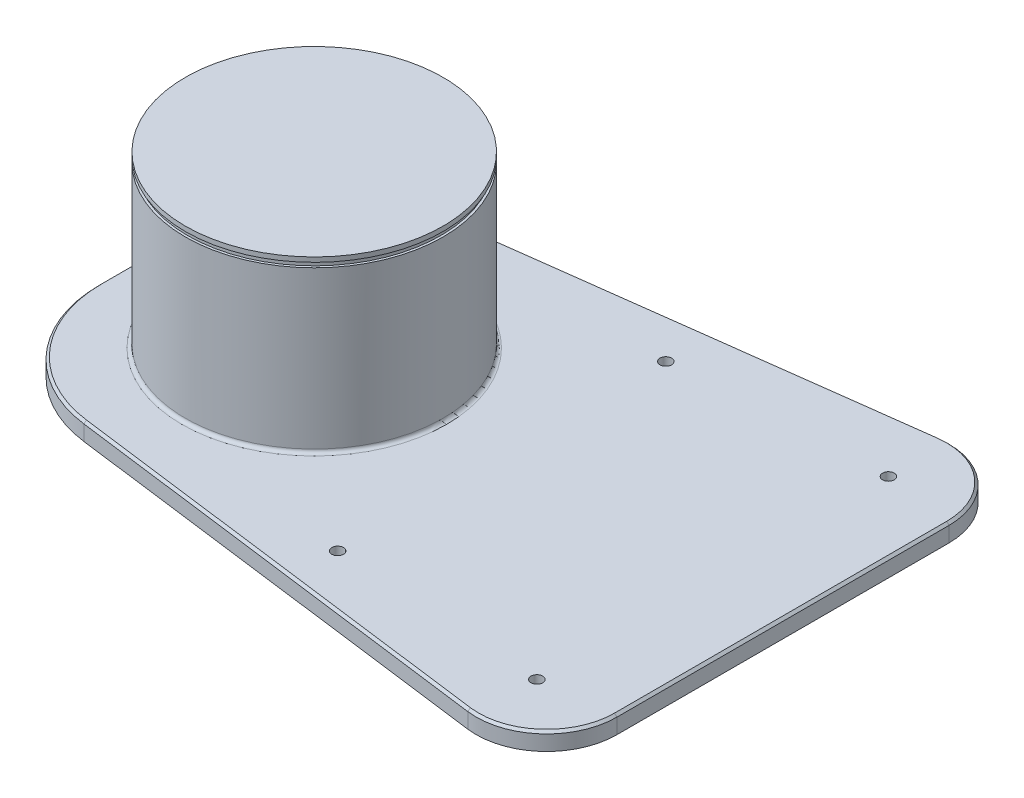
ISO-10303-21;
HEADER;
FILE_DESCRIPTION(('STEP AP214'),'2;1');
FILE_NAME('part.step','',(''),(''),'','','');
FILE_SCHEMA(('AUTOMOTIVE_DESIGN { 1 0 10303 214 1 1 1 1 }'));
ENDSEC;
DATA;
#1=APPLICATION_CONTEXT('core data for automotive mechanical design processes');
#2=APPLICATION_PROTOCOL_DEFINITION('international standard','automotive_design',2000,#1);
#3=PRODUCT_CONTEXT('',#1,'mechanical');
#4=PRODUCT('Part','Part','',(#3));
#5=PRODUCT_RELATED_PRODUCT_CATEGORY('part','',(#4));
#6=PRODUCT_DEFINITION_FORMATION('','',#4);
#7=PRODUCT_DEFINITION_CONTEXT('part definition',#1,'design');
#8=PRODUCT_DEFINITION('design','',#6,#7);
#9=PRODUCT_DEFINITION_SHAPE('','',#8);
#10=(LENGTH_UNIT() NAMED_UNIT(*) SI_UNIT(.MILLI.,.METRE.));
#11=(NAMED_UNIT(*) PLANE_ANGLE_UNIT() SI_UNIT($,.RADIAN.));
#12=(NAMED_UNIT(*) SI_UNIT($,.STERADIAN.) SOLID_ANGLE_UNIT());
#13=UNCERTAINTY_MEASURE_WITH_UNIT(LENGTH_MEASURE(1.E-05),#10,'distance_accuracy_value','');
#14=(GEOMETRIC_REPRESENTATION_CONTEXT(3) GLOBAL_UNCERTAINTY_ASSIGNED_CONTEXT((#13)) GLOBAL_UNIT_ASSIGNED_CONTEXT((#10,
#11,#12)) REPRESENTATION_CONTEXT('',''));
#15=CARTESIAN_POINT('',(0.,0.,0.));
#16=DIRECTION('',(0.,0.,1.));
#17=DIRECTION('',(1.,0.,0.));
#18=AXIS2_PLACEMENT_3D('',#15,#16,#17);
#19=CARTESIAN_POINT('',(0.,160.,0.));
#20=DIRECTION('',(0.,-1.,0.));
#21=DIRECTION('',(0.,0.,-1.));
#22=AXIS2_PLACEMENT_3D('',#19,#20,#21);
#23=CYLINDRICAL_SURFACE('',#22,110.);
#24=CARTESIAN_POINT('',(0.,18.,0.));
#25=DIRECTION('',(0.,-1.,0.));
#26=DIRECTION('',(0.,0.,-1.));
#27=AXIS2_PLACEMENT_3D('',#24,#25,#26);
#28=CIRCLE('',#27,110.);
#29=CARTESIAN_POINT('',(0.,18.,-110.));
#30=VERTEX_POINT('',#29);
#31=EDGE_CURVE('E183',#30,#30,#28,.F.);
#32=ORIENTED_EDGE('',*,*,#31,.T.);
#33=EDGE_LOOP('',(#32));
#34=FACE_BOUND('',#33,.T.);
#35=CARTESIAN_POINT('',(0.,152.,0.));
#36=DIRECTION('',(0.,1.,0.));
#37=DIRECTION('',(0.,0.,1.));
#38=AXIS2_PLACEMENT_3D('',#35,#36,#37);
#39=CIRCLE('',#38,110.);
#40=CARTESIAN_POINT('',(0.,152.,110.));
#41=VERTEX_POINT('',#40);
#42=EDGE_CURVE('E208',#41,#41,#39,.T.);
#43=ORIENTED_EDGE('',*,*,#42,.F.);
#44=EDGE_LOOP('',(#43));
#45=FACE_BOUND('',#44,.T.);
#46=ADVANCED_FACE('F90',(#34,#45),#23,.T.);
#47=CARTESIAN_POINT('',(-30.,15.,-43.3388983031987));
#48=DIRECTION('',(0.,-1.,0.));
#49=DIRECTION('',(0.,0.,-1.));
#50=AXIS2_PLACEMENT_3D('',#47,#48,#49);
#51=CYLINDRICAL_SURFACE('',#50,110.);
#52=DIRECTION('',(0.,-1.,0.));
#53=VECTOR('',#52,1.);
#54=CARTESIAN_POINT('',(-140.,15.,-43.338898303198));
#55=LINE('',#54,#53);
#56=CARTESIAN_POINT('',(-140.,13.0000000000001,-43.338898303198));
#57=VERTEX_POINT('',#56);
#58=CARTESIAN_POINT('',(-140.,0.,-43.338898303198));
#59=VERTEX_POINT('',#58);
#60=EDGE_CURVE('E179',#57,#59,#55,.T.);
#61=ORIENTED_EDGE('',*,*,#60,.F.);
#62=CARTESIAN_POINT('',(-30.,13.0000000000001,-43.3388983031987));
#63=DIRECTION('',(0.,-1.,0.));
#64=DIRECTION('',(0.,0.,-1.));
#65=AXIS2_PLACEMENT_3D('',#62,#63,#64);
#66=CIRCLE('',#65,110.);
#67=CARTESIAN_POINT('',(-44.1409431505528,13.0000000000001,-152.426174036039));
#68=VERTEX_POINT('',#67);
#69=EDGE_CURVE('E13',#57,#68,#66,.T.);
#70=ORIENTED_EDGE('',*,*,#69,.T.);
#71=DIRECTION('',(0.,-1.,0.));
#72=VECTOR('',#71,1.);
#73=CARTESIAN_POINT('',(-44.1409431505528,15.,-152.426174036039));
#74=LINE('',#73,#72);
#75=CARTESIAN_POINT('',(-44.1409431505528,0.,-152.426174036039));
#76=VERTEX_POINT('',#75);
#77=EDGE_CURVE('E200',#68,#76,#74,.T.);
#78=ORIENTED_EDGE('',*,*,#77,.T.);
#79=CARTESIAN_POINT('',(-30.,0.,-43.3388983031987));
#80=DIRECTION('',(0.,1.,0.));
#81=DIRECTION('',(0.,0.,-1.));
#82=AXIS2_PLACEMENT_3D('',#79,#80,#81);
#83=CIRCLE('',#82,110.);
#84=EDGE_CURVE('E192',#76,#59,#83,.T.);
#85=ORIENTED_EDGE('',*,*,#84,.T.);
#86=EDGE_LOOP('',(#61,#70,#78,#85));
#87=FACE_BOUND('',#86,.T.);
#88=ADVANCED_FACE('F196',(#87),#51,.T.);
#89=CARTESIAN_POINT('',(-140.,15.,-43.338898303198));
#90=DIRECTION('',(1.,0.,0.));
#91=DIRECTION('',(0.,0.,-1.));
#92=AXIS2_PLACEMENT_3D('',#89,#90,#91);
#93=PLANE('',#92);
#94=DIRECTION('',(0.,-1.,0.));
#95=VECTOR('',#94,1.);
#96=CARTESIAN_POINT('',(-140.,15.,43.338898303198));
#97=LINE('',#96,#95);
#98=CARTESIAN_POINT('',(-140.,13.0000000000001,43.338898303198));
#99=VERTEX_POINT('',#98);
#100=CARTESIAN_POINT('',(-140.,0.,43.338898303198));
#101=VERTEX_POINT('',#100);
#102=EDGE_CURVE('E186',#99,#101,#97,.T.);
#103=ORIENTED_EDGE('',*,*,#102,.F.);
#104=DIRECTION('',(0.,0.,-1.));
#105=VECTOR('',#104,1.);
#106=CARTESIAN_POINT('',(-140.,13.0000000000001,-43.338898303198));
#107=LINE('',#106,#105);
#108=EDGE_CURVE('E99',#99,#57,#107,.T.);
#109=ORIENTED_EDGE('',*,*,#108,.T.);
#110=ORIENTED_EDGE('',*,*,#60,.T.);
#111=DIRECTION('',(0.,0.,1.));
#112=VECTOR('',#111,1.);
#113=CARTESIAN_POINT('',(-140.,0.,-43.338898303198));
#114=LINE('',#113,#112);
#115=EDGE_CURVE('E182',#59,#101,#114,.T.);
#116=ORIENTED_EDGE('',*,*,#115,.T.);
#117=EDGE_LOOP('',(#103,#109,#110,#116));
#118=FACE_BOUND('',#117,.T.);
#119=ADVANCED_FACE('F180',(#118),#93,.F.);
#120=CARTESIAN_POINT('',(-30.,15.,43.3388983031987));
#121=DIRECTION('',(0.,-1.,0.));
#122=DIRECTION('',(0.,0.,-1.));
#123=AXIS2_PLACEMENT_3D('',#120,#121,#122);
#124=CYLINDRICAL_SURFACE('',#123,110.);
#125=DIRECTION('',(0.,-1.,0.));
#126=VECTOR('',#125,1.);
#127=CARTESIAN_POINT('',(-44.1409431505528,15.,152.426174036039));
#128=LINE('',#127,#126);
#129=CARTESIAN_POINT('',(-44.1409431505528,13.0000000000001,152.426174036039));
#130=VERTEX_POINT('',#129);
#131=CARTESIAN_POINT('',(-44.1409431505528,0.,152.426174036039));
#132=VERTEX_POINT('',#131);
#133=EDGE_CURVE('E249',#130,#132,#128,.T.);
#134=ORIENTED_EDGE('',*,*,#133,.F.);
#135=CARTESIAN_POINT('',(-30.,13.0000000000001,43.3388983031987));
#136=DIRECTION('',(0.,-1.,0.));
#137=DIRECTION('',(0.,0.,-1.));
#138=AXIS2_PLACEMENT_3D('',#135,#136,#137);
#139=CIRCLE('',#138,110.);
#140=EDGE_CURVE('E308',#130,#99,#139,.T.);
#141=ORIENTED_EDGE('',*,*,#140,.T.);
#142=ORIENTED_EDGE('',*,*,#102,.T.);
#143=CARTESIAN_POINT('',(-30.,0.,43.3388983031987));
#144=DIRECTION('',(0.,1.,0.));
#145=DIRECTION('',(0.,0.,1.));
#146=AXIS2_PLACEMENT_3D('',#143,#144,#145);
#147=CIRCLE('',#146,110.);
#148=EDGE_CURVE('E195',#101,#132,#147,.T.);
#149=ORIENTED_EDGE('',*,*,#148,.T.);
#150=EDGE_LOOP('',(#134,#141,#142,#149));
#151=FACE_BOUND('',#150,.T.);
#152=ADVANCED_FACE('F497',(#151),#124,.T.);
#153=CARTESIAN_POINT('',(-44.1409431505528,15.,152.426174036039));
#154=DIRECTION('',(0.128554028641395,0.,-0.991702506662188));
#155=DIRECTION('',(-0.991702506662188,0.,-0.128554028641395));
#156=AXIS2_PLACEMENT_3D('',#153,#154,#155);
#157=PLANE('',#156);
#158=DIRECTION('',(0.,-1.,0.));
#159=VECTOR('',#158,1.);
#160=CARTESIAN_POINT('',(332.286758281516,15.,201.222357555011));
#161=LINE('',#160,#159);
#162=CARTESIAN_POINT('',(332.286758281516,13.0000000000001,201.222357555011));
#163=VERTEX_POINT('',#162);
#164=CARTESIAN_POINT('',(332.286758281516,0.,201.222357555011));
#165=VERTEX_POINT('',#164);
#166=EDGE_CURVE('E244',#163,#165,#161,.T.);
#167=ORIENTED_EDGE('',*,*,#166,.F.);
#168=DIRECTION('',(-0.991702506662188,0.,-0.128554028641395));
#169=VECTOR('',#168,1.);
#170=CARTESIAN_POINT('',(-44.1409431505528,13.0000000000001,152.426174036039));
#171=LINE('',#170,#169);
#172=EDGE_CURVE('E299',#163,#130,#171,.T.);
#173=ORIENTED_EDGE('',*,*,#172,.T.);
#174=ORIENTED_EDGE('',*,*,#133,.T.);
#175=DIRECTION('',(0.991702506662188,0.,0.128554028641395));
#176=VECTOR('',#175,1.);
#177=CARTESIAN_POINT('',(-44.1409431505528,0.,152.426174036039));
#178=LINE('',#177,#176);
#179=EDGE_CURVE('E212',#132,#165,#178,.T.);
#180=ORIENTED_EDGE('',*,*,#179,.T.);
#181=EDGE_LOOP('',(#167,#173,#174,#180));
#182=FACE_BOUND('',#181,.T.);
#183=ADVANCED_FACE('F495',(#182),#157,.F.);
#184=CARTESIAN_POINT('',(340.,15.,141.72020715528));
#185=DIRECTION('',(0.,-1.,0.));
#186=DIRECTION('',(0.,0.,-1.));
#187=AXIS2_PLACEMENT_3D('',#184,#185,#186);
#188=CYLINDRICAL_SURFACE('',#187,60.);
#189=DIRECTION('',(0.,-1.,0.));
#190=VECTOR('',#189,1.);
#191=CARTESIAN_POINT('',(400.,15.,141.72020715528));
#192=LINE('',#191,#190);
#193=CARTESIAN_POINT('',(400.,13.0000000000001,141.72020715528));
#194=VERTEX_POINT('',#193);
#195=CARTESIAN_POINT('',(400.,0.,141.72020715528));
#196=VERTEX_POINT('',#195);
#197=EDGE_CURVE('E245',#194,#196,#192,.T.);
#198=ORIENTED_EDGE('',*,*,#197,.F.);
#199=CARTESIAN_POINT('',(340.,13.0000000000001,141.72020715528));
#200=DIRECTION('',(0.,-1.,0.));
#201=DIRECTION('',(0.,0.,-1.));
#202=AXIS2_PLACEMENT_3D('',#199,#200,#201);
#203=CIRCLE('',#202,60.);
#204=EDGE_CURVE('E291',#194,#163,#203,.T.);
#205=ORIENTED_EDGE('',*,*,#204,.T.);
#206=ORIENTED_EDGE('',*,*,#166,.T.);
#207=CARTESIAN_POINT('',(340.,0.,141.72020715528));
#208=DIRECTION('',(0.,1.,0.));
#209=DIRECTION('',(0.,0.,1.));
#210=AXIS2_PLACEMENT_3D('',#207,#208,#209);
#211=CIRCLE('',#210,60.);
#212=EDGE_CURVE('E218',#165,#196,#211,.T.);
#213=ORIENTED_EDGE('',*,*,#212,.T.);
#214=EDGE_LOOP('',(#198,#205,#206,#213));
#215=FACE_BOUND('',#214,.T.);
#216=ADVANCED_FACE('F488',(#215),#188,.T.);
#217=CARTESIAN_POINT('',(400.,15.,141.72020715528));
#218=DIRECTION('',(-1.,0.,0.));
#219=DIRECTION('',(0.,0.,1.));
#220=AXIS2_PLACEMENT_3D('',#217,#218,#219);
#221=PLANE('',#220);
#222=DIRECTION('',(0.,-1.,0.));
#223=VECTOR('',#222,1.);
#224=CARTESIAN_POINT('',(400.,15.,-141.72020715528));
#225=LINE('',#224,#223);
#226=CARTESIAN_POINT('',(400.,13.0000000000001,-141.72020715528));
#227=VERTEX_POINT('',#226);
#228=CARTESIAN_POINT('',(400.,0.,-141.72020715528));
#229=VERTEX_POINT('',#228);
#230=EDGE_CURVE('E239',#227,#229,#225,.T.);
#231=ORIENTED_EDGE('',*,*,#230,.F.);
#232=DIRECTION('',(0.,0.,1.));
#233=VECTOR('',#232,1.);
#234=CARTESIAN_POINT('',(400.,13.0000000000001,141.72020715528));
#235=LINE('',#234,#233);
#236=EDGE_CURVE('E300',#227,#194,#235,.T.);
#237=ORIENTED_EDGE('',*,*,#236,.T.);
#238=ORIENTED_EDGE('',*,*,#197,.T.);
#239=DIRECTION('',(0.,0.,-1.));
#240=VECTOR('',#239,1.);
#241=CARTESIAN_POINT('',(400.,0.,141.72020715528));
#242=LINE('',#241,#240);
#243=EDGE_CURVE('E224',#196,#229,#242,.T.);
#244=ORIENTED_EDGE('',*,*,#243,.T.);
#245=EDGE_LOOP('',(#231,#237,#238,#244));
#246=FACE_BOUND('',#245,.T.);
#247=ADVANCED_FACE('F482',(#246),#221,.F.);
#248=CARTESIAN_POINT('',(340.,15.,-141.72020715528));
#249=DIRECTION('',(0.,-1.,0.));
#250=DIRECTION('',(0.,0.,-1.));
#251=AXIS2_PLACEMENT_3D('',#248,#249,#250);
#252=CYLINDRICAL_SURFACE('',#251,60.);
#253=DIRECTION('',(0.,-1.,0.));
#254=VECTOR('',#253,1.);
#255=CARTESIAN_POINT('',(332.286758281516,15.,-201.222357555011));
#256=LINE('',#255,#254);
#257=CARTESIAN_POINT('',(332.286758281516,13.0000000000001,-201.222357555011));
#258=VERTEX_POINT('',#257);
#259=CARTESIAN_POINT('',(332.286758281516,0.,-201.222357555011));
#260=VERTEX_POINT('',#259);
#261=EDGE_CURVE('E237',#258,#260,#256,.T.);
#262=ORIENTED_EDGE('',*,*,#261,.F.);
#263=CARTESIAN_POINT('',(340.,13.0000000000001,-141.72020715528));
#264=DIRECTION('',(0.,-1.,0.));
#265=DIRECTION('',(0.,0.,-1.));
#266=AXIS2_PLACEMENT_3D('',#263,#264,#265);
#267=CIRCLE('',#266,60.);
#268=EDGE_CURVE('E304',#258,#227,#267,.T.);
#269=ORIENTED_EDGE('',*,*,#268,.T.);
#270=ORIENTED_EDGE('',*,*,#230,.T.);
#271=CARTESIAN_POINT('',(340.,0.,-141.72020715528));
#272=DIRECTION('',(0.,1.,0.));
#273=DIRECTION('',(0.,0.,1.));
#274=AXIS2_PLACEMENT_3D('',#271,#272,#273);
#275=CIRCLE('',#274,60.);
#276=EDGE_CURVE('E230',#229,#260,#275,.T.);
#277=ORIENTED_EDGE('',*,*,#276,.T.);
#278=EDGE_LOOP('',(#262,#269,#270,#277));
#279=FACE_BOUND('',#278,.T.);
#280=ADVANCED_FACE('F480',(#279),#252,.T.);
#281=CARTESIAN_POINT('',(332.286758281516,15.,-201.222357555011));
#282=DIRECTION('',(0.128554028641395,0.,0.991702506662188));
#283=DIRECTION('',(0.991702506662188,0.,-0.128554028641395));
#284=AXIS2_PLACEMENT_3D('',#281,#282,#283);
#285=PLANE('',#284);
#286=ORIENTED_EDGE('',*,*,#77,.F.);
#287=DIRECTION('',(0.991702506662188,0.,-0.128554028641395));
#288=VECTOR('',#287,1.);
#289=CARTESIAN_POINT('',(332.286758281516,13.0000000000001,-201.222357555011));
#290=LINE('',#289,#288);
#291=EDGE_CURVE('E310',#68,#258,#290,.T.);
#292=ORIENTED_EDGE('',*,*,#291,.T.);
#293=ORIENTED_EDGE('',*,*,#261,.T.);
#294=DIRECTION('',(-0.991702506662188,0.,0.128554028641395));
#295=VECTOR('',#294,1.);
#296=CARTESIAN_POINT('',(332.286758281516,0.,-201.222357555011));
#297=LINE('',#296,#295);
#298=EDGE_CURVE('E231',#260,#76,#297,.T.);
#299=ORIENTED_EDGE('',*,*,#298,.T.);
#300=EDGE_LOOP('',(#286,#292,#293,#299));
#301=FACE_BOUND('',#300,.T.);
#302=ADVANCED_FACE('F465',(#301),#285,.F.);
#303=CARTESIAN_POINT('',(-30.,15.,-43.3388983031987));
#304=DIRECTION('',(0.,-1.,0.));
#305=DIRECTION('',(0.,0.,-1.));
#306=AXIS2_PLACEMENT_3D('',#303,#304,#305);
#307=PLANE('',#306);
#308=DIRECTION('',(0.991702506662188,0.,0.128554028641395));
#309=VECTOR('',#308,1.);
#310=CARTESIAN_POINT('',(-54.9341578984033,15.,149.010319770198));
#311=LINE('',#310,#309);
#312=CARTESIAN_POINT('',(-43.88383509327,15.,150.442769022715));
#313=VERTEX_POINT('',#312);
#314=CARTESIAN_POINT('',(332.543866338799,15.,199.238952541687));
#315=VERTEX_POINT('',#314);
#316=EDGE_CURVE('E282',#313,#315,#311,.T.);
#317=ORIENTED_EDGE('',*,*,#316,.T.);
#318=CARTESIAN_POINT('',(340.,15.,141.72020715528));
#319=DIRECTION('',(0.,-1.,0.));
#320=DIRECTION('',(0.,0.,-1.));
#321=AXIS2_PLACEMENT_3D('',#318,#319,#320);
#322=CIRCLE('',#321,58.0000000000001);
#323=CARTESIAN_POINT('',(398.,15.,141.72020715528));
#324=VERTEX_POINT('',#323);
#325=EDGE_CURVE('E288',#315,#324,#322,.F.);
#326=ORIENTED_EDGE('',*,*,#325,.T.);
#327=DIRECTION('',(0.,0.,-1.));
#328=VECTOR('',#327,1.);
#329=CARTESIAN_POINT('',(398.,15.,-43.3388983031987));
#330=LINE('',#329,#328);
#331=CARTESIAN_POINT('',(398.,15.,-141.72020715528));
#332=VERTEX_POINT('',#331);
#333=EDGE_CURVE('E286',#324,#332,#330,.T.);
#334=ORIENTED_EDGE('',*,*,#333,.T.);
#335=CARTESIAN_POINT('',(340.,15.,-141.72020715528));
#336=DIRECTION('',(0.,-1.,0.));
#337=DIRECTION('',(0.,0.,-1.));
#338=AXIS2_PLACEMENT_3D('',#335,#336,#337);
#339=CIRCLE('',#338,58.0000000000001);
#340=CARTESIAN_POINT('',(332.543866338799,15.,-199.238952541687));
#341=VERTEX_POINT('',#340);
#342=EDGE_CURVE('E278',#332,#341,#339,.F.);
#343=ORIENTED_EDGE('',*,*,#342,.T.);
#344=DIRECTION('',(-0.991702506662188,0.,0.128554028641395));
#345=VECTOR('',#344,1.);
#346=CARTESIAN_POINT('',(-43.8838350932707,15.,-150.442769022715));
#347=LINE('',#346,#345);
#348=CARTESIAN_POINT('',(-43.88383509327,15.,-150.442769022715));
#349=VERTEX_POINT('',#348);
#350=EDGE_CURVE('E273',#341,#349,#347,.T.);
#351=ORIENTED_EDGE('',*,*,#350,.T.);
#352=CARTESIAN_POINT('',(-30.,15.,-43.3388983031987));
#353=DIRECTION('',(0.,-1.,0.));
#354=DIRECTION('',(0.,0.,-1.));
#355=AXIS2_PLACEMENT_3D('',#352,#353,#354);
#356=CIRCLE('',#355,108.);
#357=CARTESIAN_POINT('',(-138.,15.,-43.338898303198));
#358=VERTEX_POINT('',#357);
#359=EDGE_CURVE('E268',#349,#358,#356,.F.);
#360=ORIENTED_EDGE('',*,*,#359,.T.);
#361=DIRECTION('',(0.,0.,1.));
#362=VECTOR('',#361,1.);
#363=CARTESIAN_POINT('',(-138.,15.,-43.3388983031987));
#364=LINE('',#363,#362);
#365=CARTESIAN_POINT('',(-138.,15.,43.338898303198));
#366=VERTEX_POINT('',#365);
#367=EDGE_CURVE('E271',#358,#366,#364,.T.);
#368=ORIENTED_EDGE('',*,*,#367,.T.);
#369=CARTESIAN_POINT('',(-30.,15.,43.3388983031987));
#370=DIRECTION('',(0.,-1.,0.));
#371=DIRECTION('',(0.,0.,-1.));
#372=AXIS2_PLACEMENT_3D('',#369,#370,#371);
#373=CIRCLE('',#372,108.);
#374=EDGE_CURVE('E280',#366,#313,#373,.F.);
#375=ORIENTED_EDGE('',*,*,#374,.T.);
#376=EDGE_LOOP('',(#317,#326,#334,#343,#351,#360,#368,#375));
#377=FACE_BOUND('',#376,.T.);
#378=CARTESIAN_POINT('',(0.,15.,0.));
#379=DIRECTION('',(0.,-1.,0.));
#380=DIRECTION('',(0.,0.,-1.));
#381=AXIS2_PLACEMENT_3D('',#378,#379,#380);
#382=CIRCLE('',#381,113.);
#383=CARTESIAN_POINT('',(0.,15.,-113.));
#384=VERTEX_POINT('',#383);
#385=EDGE_CURVE('E262',#384,#384,#382,.T.);
#386=ORIENTED_EDGE('',*,*,#385,.T.);
#387=EDGE_LOOP('',(#386));
#388=FACE_BOUND('',#387,.T.);
#389=CARTESIAN_POINT('',(340.,15.,-150.));
#390=DIRECTION('',(0.,1.,0.));
#391=DIRECTION('',(0.,0.,1.));
#392=AXIS2_PLACEMENT_3D('',#389,#390,#391);
#393=CIRCLE('',#392,5.);
#394=CARTESIAN_POINT('',(340.,15.,-145.));
#395=VERTEX_POINT('',#394);
#396=EDGE_CURVE('E362',#395,#395,#393,.T.);
#397=ORIENTED_EDGE('',*,*,#396,.F.);
#398=EDGE_LOOP('',(#397));
#399=FACE_BOUND('',#398,.T.);
#400=CARTESIAN_POINT('',(160.,15.,140.));
#401=DIRECTION('',(0.,1.,0.));
#402=DIRECTION('',(0.,0.,1.));
#403=AXIS2_PLACEMENT_3D('',#400,#401,#402);
#404=CIRCLE('',#403,5.);
#405=CARTESIAN_POINT('',(160.,15.,145.));
#406=VERTEX_POINT('',#405);
#407=EDGE_CURVE('E371',#406,#406,#404,.T.);
#408=ORIENTED_EDGE('',*,*,#407,.F.);
#409=EDGE_LOOP('',(#408));
#410=FACE_BOUND('',#409,.T.);
#411=CARTESIAN_POINT('',(160.,15.,-140.));
#412=DIRECTION('',(0.,1.,0.));
#413=DIRECTION('',(0.,0.,1.));
#414=AXIS2_PLACEMENT_3D('',#411,#412,#413);
#415=CIRCLE('',#414,5.);
#416=CARTESIAN_POINT('',(160.,15.,-135.));
#417=VERTEX_POINT('',#416);
#418=EDGE_CURVE('E355',#417,#417,#415,.T.);
#419=ORIENTED_EDGE('',*,*,#418,.F.);
#420=EDGE_LOOP('',(#419));
#421=FACE_BOUND('',#420,.T.);
#422=CARTESIAN_POINT('',(340.,15.,150.));
#423=DIRECTION('',(0.,1.,0.));
#424=DIRECTION('',(0.,0.,1.));
#425=AXIS2_PLACEMENT_3D('',#422,#423,#424);
#426=CIRCLE('',#425,5.);
#427=CARTESIAN_POINT('',(340.,15.,155.));
#428=VERTEX_POINT('',#427);
#429=EDGE_CURVE('E368',#428,#428,#426,.T.);
#430=ORIENTED_EDGE('',*,*,#429,.F.);
#431=EDGE_LOOP('',(#430));
#432=FACE_BOUND('',#431,.T.);
#433=ADVANCED_FACE('F459',(#377,#388,#399,#410,#421,#432),#307,.F.);
#434=CARTESIAN_POINT('',(-30.,0.,-43.3388983031987));
#435=DIRECTION('',(0.,-1.,0.));
#436=DIRECTION('',(0.,0.,-1.));
#437=AXIS2_PLACEMENT_3D('',#434,#435,#436);
#438=PLANE('',#437);
#439=CARTESIAN_POINT('',(340.,0.,-150.));
#440=DIRECTION('',(0.,1.,0.));
#441=DIRECTION('',(0.,0.,1.));
#442=AXIS2_PLACEMENT_3D('',#439,#440,#441);
#443=CIRCLE('',#442,5.);
#444=CARTESIAN_POINT('',(340.,0.,-145.));
#445=VERTEX_POINT('',#444);
#446=EDGE_CURVE('E370',#445,#445,#443,.T.);
#447=ORIENTED_EDGE('',*,*,#446,.T.);
#448=EDGE_LOOP('',(#447));
#449=FACE_BOUND('',#448,.T.);
#450=CARTESIAN_POINT('',(160.,0.,140.));
#451=DIRECTION('',(0.,1.,0.));
#452=DIRECTION('',(0.,0.,1.));
#453=AXIS2_PLACEMENT_3D('',#450,#451,#452);
#454=CIRCLE('',#453,5.);
#455=CARTESIAN_POINT('',(160.,0.,145.));
#456=VERTEX_POINT('',#455);
#457=EDGE_CURVE('E358',#456,#456,#454,.T.);
#458=ORIENTED_EDGE('',*,*,#457,.T.);
#459=EDGE_LOOP('',(#458));
#460=FACE_BOUND('',#459,.T.);
#461=CARTESIAN_POINT('',(160.,0.,-140.));
#462=DIRECTION('',(0.,1.,0.));
#463=DIRECTION('',(0.,0.,1.));
#464=AXIS2_PLACEMENT_3D('',#461,#462,#463);
#465=CIRCLE('',#464,5.);
#466=CARTESIAN_POINT('',(160.,0.,-135.));
#467=VERTEX_POINT('',#466);
#468=EDGE_CURVE('E345',#467,#467,#465,.T.);
#469=ORIENTED_EDGE('',*,*,#468,.T.);
#470=EDGE_LOOP('',(#469));
#471=FACE_BOUND('',#470,.T.);
#472=CARTESIAN_POINT('',(340.,0.,150.));
#473=DIRECTION('',(0.,1.,0.));
#474=DIRECTION('',(0.,0.,1.));
#475=AXIS2_PLACEMENT_3D('',#472,#473,#474);
#476=CIRCLE('',#475,5.);
#477=CARTESIAN_POINT('',(340.,0.,155.));
#478=VERTEX_POINT('',#477);
#479=EDGE_CURVE('E378',#478,#478,#476,.T.);
#480=ORIENTED_EDGE('',*,*,#479,.T.);
#481=EDGE_LOOP('',(#480));
#482=FACE_BOUND('',#481,.T.);
#483=ORIENTED_EDGE('',*,*,#84,.F.);
#484=ORIENTED_EDGE('',*,*,#298,.F.);
#485=ORIENTED_EDGE('',*,*,#276,.F.);
#486=ORIENTED_EDGE('',*,*,#243,.F.);
#487=ORIENTED_EDGE('',*,*,#212,.F.);
#488=ORIENTED_EDGE('',*,*,#179,.F.);
#489=ORIENTED_EDGE('',*,*,#148,.F.);
#490=ORIENTED_EDGE('',*,*,#115,.F.);
#491=EDGE_LOOP('',(#483,#484,#485,#486,#487,#488,#489,#490));
#492=FACE_BOUND('',#491,.T.);
#493=ADVANCED_FACE('F189',(#449,#460,#471,#482,#492),#438,.T.);
#494=CARTESIAN_POINT('',(0.,152.,0.));
#495=DIRECTION('',(0.,1.,0.));
#496=DIRECTION('',(0.,0.,1.));
#497=AXIS2_PLACEMENT_3D('',#494,#495,#496);
#498=PLANE('',#497);
#499=CARTESIAN_POINT('',(0.,152.,0.));
#500=DIRECTION('',(0.,1.,0.));
#501=DIRECTION('',(0.,0.,1.));
#502=AXIS2_PLACEMENT_3D('',#499,#500,#501);
#503=CIRCLE('',#502,108.);
#504=CARTESIAN_POINT('',(0.,152.,108.));
#505=VERTEX_POINT('',#504);
#506=EDGE_CURVE('E260',#505,#505,#503,.T.);
#507=ORIENTED_EDGE('',*,*,#506,.F.);
#508=EDGE_LOOP('',(#507));
#509=FACE_BOUND('',#508,.T.);
#510=ORIENTED_EDGE('',*,*,#42,.T.);
#511=EDGE_LOOP('',(#510));
#512=FACE_BOUND('',#511,.T.);
#513=ADVANCED_FACE('F407',(#509,#512),#498,.T.);
#514=CARTESIAN_POINT('',(0.,156.,0.));
#515=DIRECTION('',(0.,1.,0.));
#516=DIRECTION('',(0.,0.,1.));
#517=AXIS2_PLACEMENT_3D('',#514,#515,#516);
#518=PLANE('',#517);
#519=CARTESIAN_POINT('',(0.,156.,0.));
#520=DIRECTION('',(0.,1.,0.));
#521=DIRECTION('',(0.,0.,1.));
#522=AXIS2_PLACEMENT_3D('',#519,#520,#521);
#523=CIRCLE('',#522,108.);
#524=CARTESIAN_POINT('',(0.,156.,108.));
#525=VERTEX_POINT('',#524);
#526=EDGE_CURVE('E385',#525,#525,#523,.T.);
#527=ORIENTED_EDGE('',*,*,#526,.T.);
#528=EDGE_LOOP('',(#527));
#529=FACE_BOUND('',#528,.T.);
#530=CARTESIAN_POINT('',(0.,156.,0.));
#531=DIRECTION('',(0.,1.,0.));
#532=DIRECTION('',(0.,0.,1.));
#533=AXIS2_PLACEMENT_3D('',#530,#531,#532);
#534=CIRCLE('',#533,110.);
#535=CARTESIAN_POINT('',(0.,156.,110.));
#536=VERTEX_POINT('',#535);
#537=EDGE_CURVE('E251',#536,#536,#534,.T.);
#538=ORIENTED_EDGE('',*,*,#537,.F.);
#539=EDGE_LOOP('',(#538));
#540=FACE_BOUND('',#539,.T.);
#541=ADVANCED_FACE('F392',(#529,#540),#518,.F.);
#542=CARTESIAN_POINT('',(0.,152.,0.));
#543=DIRECTION('',(0.,1.,0.));
#544=DIRECTION('',(0.,0.,1.));
#545=AXIS2_PLACEMENT_3D('',#542,#543,#544);
#546=CYLINDRICAL_SURFACE('',#545,108.);
#547=ORIENTED_EDGE('',*,*,#506,.T.);
#548=EDGE_LOOP('',(#547));
#549=FACE_BOUND('',#548,.T.);
#550=ORIENTED_EDGE('',*,*,#526,.F.);
#551=EDGE_LOOP('',(#550));
#552=FACE_BOUND('',#551,.T.);
#553=ADVANCED_FACE('F396',(#549,#552),#546,.T.);
#554=CARTESIAN_POINT('',(0.,160.,0.));
#555=DIRECTION('',(0.,1.,0.));
#556=DIRECTION('',(0.,0.,1.));
#557=AXIS2_PLACEMENT_3D('',#554,#555,#556);
#558=PLANE('',#557);
#559=CARTESIAN_POINT('',(0.,160.,0.));
#560=DIRECTION('',(0.,1.,0.));
#561=DIRECTION('',(0.,0.,1.));
#562=AXIS2_PLACEMENT_3D('',#559,#560,#561);
#563=CIRCLE('',#562,110.);
#564=CARTESIAN_POINT('',(0.,160.,110.));
#565=VERTEX_POINT('',#564);
#566=EDGE_CURVE('E205',#565,#565,#563,.T.);
#567=ORIENTED_EDGE('',*,*,#566,.T.);
#568=EDGE_LOOP('',(#567));
#569=FACE_BOUND('',#568,.T.);
#570=ADVANCED_FACE('F399',(#569),#558,.T.);
#571=ORIENTED_EDGE('',*,*,#537,.T.);
#572=EDGE_LOOP('',(#571));
#573=FACE_BOUND('',#572,.T.);
#574=ORIENTED_EDGE('',*,*,#566,.F.);
#575=EDGE_LOOP('',(#574));
#576=FACE_BOUND('',#575,.T.);
#577=ADVANCED_FACE('F403',(#573,#576),#23,.T.);
#578=CARTESIAN_POINT('',(340.,0.,150.));
#579=DIRECTION('',(0.,1.,0.));
#580=DIRECTION('',(0.,0.,1.));
#581=AXIS2_PLACEMENT_3D('',#578,#579,#580);
#582=CYLINDRICAL_SURFACE('',#581,5.);
#583=ORIENTED_EDGE('',*,*,#479,.F.);
#584=EDGE_LOOP('',(#583));
#585=FACE_BOUND('',#584,.T.);
#586=ORIENTED_EDGE('',*,*,#429,.T.);
#587=EDGE_LOOP('',(#586));
#588=FACE_BOUND('',#587,.T.);
#589=ADVANCED_FACE('F424',(#585,#588),#582,.F.);
#590=CARTESIAN_POINT('',(160.,0.,-140.));
#591=DIRECTION('',(0.,1.,0.));
#592=DIRECTION('',(0.,0.,1.));
#593=AXIS2_PLACEMENT_3D('',#590,#591,#592);
#594=CYLINDRICAL_SURFACE('',#593,5.);
#595=ORIENTED_EDGE('',*,*,#468,.F.);
#596=EDGE_LOOP('',(#595));
#597=FACE_BOUND('',#596,.T.);
#598=ORIENTED_EDGE('',*,*,#418,.T.);
#599=EDGE_LOOP('',(#598));
#600=FACE_BOUND('',#599,.T.);
#601=ADVANCED_FACE('F431',(#597,#600),#594,.F.);
#602=CARTESIAN_POINT('',(160.,0.,140.));
#603=DIRECTION('',(0.,1.,0.));
#604=DIRECTION('',(0.,0.,1.));
#605=AXIS2_PLACEMENT_3D('',#602,#603,#604);
#606=CYLINDRICAL_SURFACE('',#605,5.);
#607=ORIENTED_EDGE('',*,*,#457,.F.);
#608=EDGE_LOOP('',(#607));
#609=FACE_BOUND('',#608,.T.);
#610=ORIENTED_EDGE('',*,*,#407,.T.);
#611=EDGE_LOOP('',(#610));
#612=FACE_BOUND('',#611,.T.);
#613=ADVANCED_FACE('F438',(#609,#612),#606,.F.);
#614=CARTESIAN_POINT('',(340.,0.,-150.));
#615=DIRECTION('',(0.,1.,0.));
#616=DIRECTION('',(0.,0.,1.));
#617=AXIS2_PLACEMENT_3D('',#614,#615,#616);
#618=CYLINDRICAL_SURFACE('',#617,5.);
#619=ORIENTED_EDGE('',*,*,#446,.F.);
#620=EDGE_LOOP('',(#619));
#621=FACE_BOUND('',#620,.T.);
#622=ORIENTED_EDGE('',*,*,#396,.T.);
#623=EDGE_LOOP('',(#622));
#624=FACE_BOUND('',#623,.T.);
#625=ADVANCED_FACE('F450',(#621,#624),#618,.F.);
#626=CARTESIAN_POINT('',(0.,18.,0.));
#627=DIRECTION('',(0.,-1.,0.));
#628=DIRECTION('',(0.,0.,-1.));
#629=AXIS2_PLACEMENT_3D('',#626,#627,#628);
#630=TOROIDAL_SURFACE('',#629,113.,3.);
#631=ORIENTED_EDGE('',*,*,#385,.F.);
#632=EDGE_LOOP('',(#631));
#633=FACE_BOUND('',#632,.T.);
#634=ORIENTED_EDGE('',*,*,#31,.F.);
#635=EDGE_LOOP('',(#634));
#636=FACE_BOUND('',#635,.T.);
#637=ADVANCED_FACE('F448',(#633,#636),#630,.F.);
#638=CARTESIAN_POINT('',(-30.,15.,-43.3388983031987));
#639=DIRECTION('',(0.,-1.,0.));
#640=DIRECTION('',(0.,0.,-1.));
#641=AXIS2_PLACEMENT_3D('',#638,#639,#640);
#642=CONICAL_SURFACE('',#641,108.,0.785398163397448);
#643=DIRECTION('',(0.0909014254011806,0.707106781186545,0.701239567380533));
#644=VECTOR('',#643,1.);
#645=CARTESIAN_POINT('',(-44.1409431505528,13.0000000000001,-152.426174036039));
#646=LINE('',#645,#644);
#647=EDGE_CURVE('E333',#68,#349,#646,.T.);
#648=ORIENTED_EDGE('',*,*,#647,.F.);
#649=ORIENTED_EDGE('',*,*,#69,.F.);
#650=DIRECTION('',(-0.707106781186548,-0.707106781186548,0.));
#651=VECTOR('',#650,1.);
#652=CARTESIAN_POINT('',(-138.,15.,-43.338898303198));
#653=LINE('',#652,#651);
#654=EDGE_CURVE('E94',#358,#57,#653,.T.);
#655=ORIENTED_EDGE('',*,*,#654,.F.);
#656=ORIENTED_EDGE('',*,*,#359,.F.);
#657=EDGE_LOOP('',(#648,#649,#655,#656));
#658=FACE_BOUND('',#657,.T.);
#659=ADVANCED_FACE('F95',(#658),#642,.T.);
#660=CARTESIAN_POINT('',(-138.,15.,-43.3388983031987));
#661=DIRECTION('',(0.707106781186543,-0.707106781186552,0.));
#662=DIRECTION('',(0.,0.,1.));
#663=AXIS2_PLACEMENT_3D('',#660,#661,#662);
#664=PLANE('',#663);
#665=ORIENTED_EDGE('',*,*,#654,.T.);
#666=ORIENTED_EDGE('',*,*,#108,.F.);
#667=DIRECTION('',(-0.707106781186552,-0.707106781186543,0.));
#668=VECTOR('',#667,1.);
#669=CARTESIAN_POINT('',(-138.,15.,43.338898303198));
#670=LINE('',#669,#668);
#671=EDGE_CURVE('E335',#366,#99,#670,.T.);
#672=ORIENTED_EDGE('',*,*,#671,.F.);
#673=ORIENTED_EDGE('',*,*,#367,.F.);
#674=EDGE_LOOP('',(#665,#666,#672,#673));
#675=FACE_BOUND('',#674,.T.);
#676=ADVANCED_FACE('F542',(#675),#664,.F.);
#677=CARTESIAN_POINT('',(-43.8838350932707,15.,-150.442769022715));
#678=DIRECTION('',(0.0909014254011795,-0.70710678118655,0.701239567380528));
#679=DIRECTION('',(-0.991702506662188,0.,0.128554028641395));
#680=AXIS2_PLACEMENT_3D('',#677,#678,#679);
#681=PLANE('',#680);
#682=ORIENTED_EDGE('',*,*,#647,.T.);
#683=ORIENTED_EDGE('',*,*,#350,.F.);
#684=DIRECTION('',(0.0909014254011878,0.707106781186546,0.701239567380531));
#685=VECTOR('',#684,1.);
#686=CARTESIAN_POINT('',(332.286758281516,13.0000000000001,-201.222357555011));
#687=LINE('',#686,#685);
#688=EDGE_CURVE('E327',#258,#341,#687,.T.);
#689=ORIENTED_EDGE('',*,*,#688,.F.);
#690=ORIENTED_EDGE('',*,*,#291,.F.);
#691=EDGE_LOOP('',(#682,#683,#689,#690));
#692=FACE_BOUND('',#691,.T.);
#693=ADVANCED_FACE('F538',(#692),#681,.F.);
#694=CARTESIAN_POINT('',(-30.,15.,43.3388983031987));
#695=DIRECTION('',(0.,-1.,0.));
#696=DIRECTION('',(0.,0.,-1.));
#697=AXIS2_PLACEMENT_3D('',#694,#695,#696);
#698=CONICAL_SURFACE('',#697,108.,0.785398163397452);
#699=ORIENTED_EDGE('',*,*,#671,.T.);
#700=ORIENTED_EDGE('',*,*,#140,.F.);
#701=DIRECTION('',(-0.0909014254011806,-0.707106781186545,0.701239567380533));
#702=VECTOR('',#701,1.);
#703=CARTESIAN_POINT('',(-43.88383509327,15.,150.442769022715));
#704=LINE('',#703,#702);
#705=EDGE_CURVE('E322',#313,#130,#704,.T.);
#706=ORIENTED_EDGE('',*,*,#705,.F.);
#707=ORIENTED_EDGE('',*,*,#374,.F.);
#708=EDGE_LOOP('',(#699,#700,#706,#707));
#709=FACE_BOUND('',#708,.T.);
#710=ADVANCED_FACE('F533',(#709),#698,.T.);
#711=CARTESIAN_POINT('',(340.,15.,-141.72020715528));
#712=DIRECTION('',(0.,-1.,0.));
#713=DIRECTION('',(0.,0.,-1.));
#714=AXIS2_PLACEMENT_3D('',#711,#712,#713);
#715=CONICAL_SURFACE('',#714,58.0000000000001,0.785398163397452);
#716=ORIENTED_EDGE('',*,*,#688,.T.);
#717=ORIENTED_EDGE('',*,*,#342,.F.);
#718=DIRECTION('',(-0.707106781186552,0.707106781186543,0.));
#719=VECTOR('',#718,1.);
#720=CARTESIAN_POINT('',(400.,13.0000000000001,-141.72020715528));
#721=LINE('',#720,#719);
#722=EDGE_CURVE('E319',#227,#332,#721,.T.);
#723=ORIENTED_EDGE('',*,*,#722,.F.);
#724=ORIENTED_EDGE('',*,*,#268,.F.);
#725=EDGE_LOOP('',(#716,#717,#723,#724));
#726=FACE_BOUND('',#725,.T.);
#727=ADVANCED_FACE('F523',(#726),#715,.T.);
#728=CARTESIAN_POINT('',(-54.9341578984033,15.,149.010319770198));
#729=DIRECTION('',(0.0909014254011799,-0.707106781186547,-0.701239567380531));
#730=DIRECTION('',(0.991702506662188,0.,0.128554028641395));
#731=AXIS2_PLACEMENT_3D('',#728,#729,#730);
#732=PLANE('',#731);
#733=ORIENTED_EDGE('',*,*,#705,.T.);
#734=ORIENTED_EDGE('',*,*,#172,.F.);
#735=DIRECTION('',(-0.0909014254011879,-0.707106781186545,0.701239567380532));
#736=VECTOR('',#735,1.);
#737=CARTESIAN_POINT('',(332.543866338799,15.,199.238952541687));
#738=LINE('',#737,#736);
#739=EDGE_CURVE('E320',#315,#163,#738,.T.);
#740=ORIENTED_EDGE('',*,*,#739,.F.);
#741=ORIENTED_EDGE('',*,*,#316,.F.);
#742=EDGE_LOOP('',(#733,#734,#740,#741));
#743=FACE_BOUND('',#742,.T.);
#744=ADVANCED_FACE('F520',(#743),#732,.F.);
#745=CARTESIAN_POINT('',(398.,15.,-43.3388983031987));
#746=DIRECTION('',(-0.707106781186543,-0.707106781186552,0.));
#747=DIRECTION('',(0.,0.,-1.));
#748=AXIS2_PLACEMENT_3D('',#745,#746,#747);
#749=PLANE('',#748);
#750=ORIENTED_EDGE('',*,*,#722,.T.);
#751=ORIENTED_EDGE('',*,*,#333,.F.);
#752=DIRECTION('',(-0.707106781186552,0.707106781186543,0.));
#753=VECTOR('',#752,1.);
#754=CARTESIAN_POINT('',(400.,13.0000000000001,141.72020715528));
#755=LINE('',#754,#753);
#756=EDGE_CURVE('E314',#194,#324,#755,.T.);
#757=ORIENTED_EDGE('',*,*,#756,.F.);
#758=ORIENTED_EDGE('',*,*,#236,.F.);
#759=EDGE_LOOP('',(#750,#751,#757,#758));
#760=FACE_BOUND('',#759,.T.);
#761=ADVANCED_FACE('F510',(#760),#749,.F.);
#762=CARTESIAN_POINT('',(340.,15.,141.72020715528));
#763=DIRECTION('',(0.,-1.,0.));
#764=DIRECTION('',(0.,0.,-1.));
#765=AXIS2_PLACEMENT_3D('',#762,#763,#764);
#766=CONICAL_SURFACE('',#765,58.0000000000001,0.78539816339745);
#767=ORIENTED_EDGE('',*,*,#739,.T.);
#768=ORIENTED_EDGE('',*,*,#204,.F.);
#769=ORIENTED_EDGE('',*,*,#756,.T.);
#770=ORIENTED_EDGE('',*,*,#325,.F.);
#771=EDGE_LOOP('',(#767,#768,#769,#770));
#772=FACE_BOUND('',#771,.T.);
#773=ADVANCED_FACE('F503',(#772),#766,.T.);
#774=CLOSED_SHELL('',(#46,#88,#119,#152,#183,#216,#247,#280,#302,#433,#493,#513,#541,#553,#570,
#577,#589,#601,#613,#625,#637,#659,#676,#693,#710,#727,#744,#761,#773));
#775=MANIFOLD_SOLID_BREP('B2',#774);
#776=ADVANCED_BREP_SHAPE_REPRESENTATION('',(#18,#775),#14);
#777=SHAPE_DEFINITION_REPRESENTATION(#9,#776);
ENDSEC;
END-ISO-10303-21;
